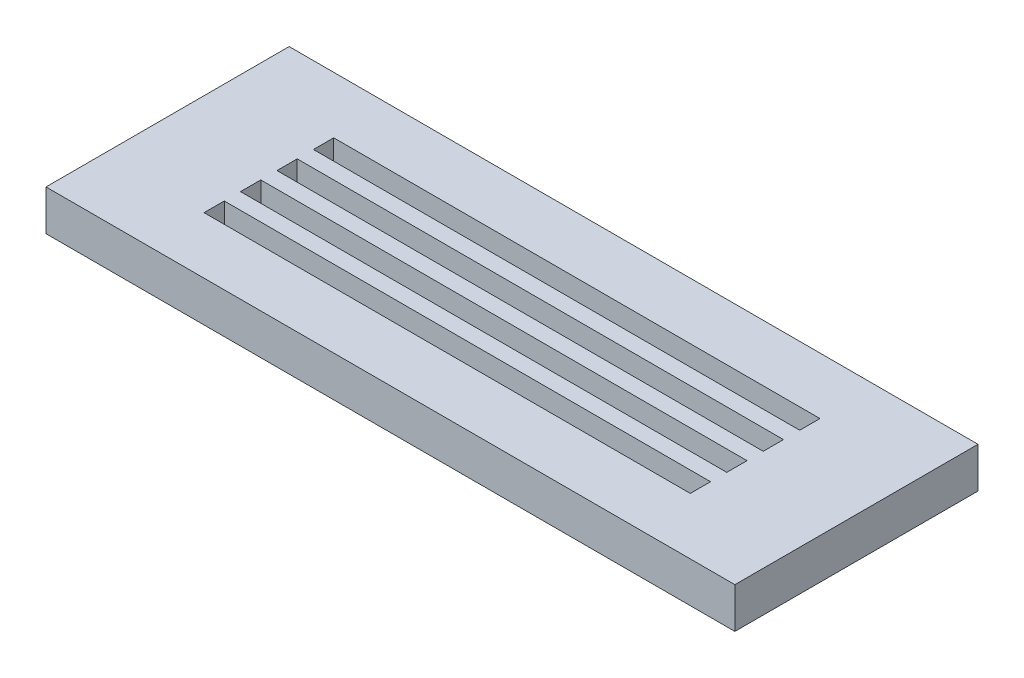
ISO-10303-21;
HEADER;
FILE_DESCRIPTION(('STEP AP214'),'2;1');
FILE_NAME('part.step','',(''),(''),'','','');
FILE_SCHEMA(('AUTOMOTIVE_DESIGN { 1 0 10303 214 1 1 1 1 }'));
ENDSEC;
DATA;
#1=APPLICATION_CONTEXT('core data for automotive mechanical design processes');
#2=APPLICATION_PROTOCOL_DEFINITION('international standard','automotive_design',2000,#1);
#3=PRODUCT_CONTEXT('',#1,'mechanical');
#4=PRODUCT('Part','Part','',(#3));
#5=PRODUCT_RELATED_PRODUCT_CATEGORY('part','',(#4));
#6=PRODUCT_DEFINITION_FORMATION('','',#4);
#7=PRODUCT_DEFINITION_CONTEXT('part definition',#1,'design');
#8=PRODUCT_DEFINITION('design','',#6,#7);
#9=PRODUCT_DEFINITION_SHAPE('','',#8);
#10=(LENGTH_UNIT() NAMED_UNIT(*) SI_UNIT(.MILLI.,.METRE.));
#11=(NAMED_UNIT(*) PLANE_ANGLE_UNIT() SI_UNIT($,.RADIAN.));
#12=(NAMED_UNIT(*) SI_UNIT($,.STERADIAN.) SOLID_ANGLE_UNIT());
#13=UNCERTAINTY_MEASURE_WITH_UNIT(LENGTH_MEASURE(1.E-05),#10,'distance_accuracy_value','');
#14=(GEOMETRIC_REPRESENTATION_CONTEXT(3) GLOBAL_UNCERTAINTY_ASSIGNED_CONTEXT((#13)) GLOBAL_UNIT_ASSIGNED_CONTEXT((#10,
#11,#12)) REPRESENTATION_CONTEXT('',''));
#15=CARTESIAN_POINT('',(0.,0.,0.));
#16=DIRECTION('',(0.,0.,1.));
#17=DIRECTION('',(1.,0.,0.));
#18=AXIS2_PLACEMENT_3D('',#15,#16,#17);
#19=CARTESIAN_POINT('',(0.,5.,0.));
#20=DIRECTION('',(1.,0.,0.));
#21=DIRECTION('',(0.,0.,-1.));
#22=AXIS2_PLACEMENT_3D('',#19,#20,#21);
#23=PLANE('',#22);
#24=DIRECTION('',(0.,0.,1.));
#25=VECTOR('',#24,1.);
#26=CARTESIAN_POINT('',(0.,0.,0.));
#27=LINE('',#26,#25);
#28=CARTESIAN_POINT('',(0.,0.,-30.));
#29=VERTEX_POINT('',#28);
#30=CARTESIAN_POINT('',(0.,0.,0.));
#31=VERTEX_POINT('',#30);
#32=EDGE_CURVE('E223',#29,#31,#27,.T.);
#33=ORIENTED_EDGE('',*,*,#32,.T.);
#34=DIRECTION('',(0.,-1.,0.));
#35=VECTOR('',#34,1.);
#36=CARTESIAN_POINT('',(0.,5.,0.));
#37=LINE('',#36,#35);
#38=CARTESIAN_POINT('',(0.,5.,0.));
#39=VERTEX_POINT('',#38);
#40=EDGE_CURVE('E11',#39,#31,#37,.T.);
#41=ORIENTED_EDGE('',*,*,#40,.F.);
#42=DIRECTION('',(0.,0.,1.));
#43=VECTOR('',#42,1.);
#44=CARTESIAN_POINT('',(0.,5.,0.));
#45=LINE('',#44,#43);
#46=CARTESIAN_POINT('',(0.,5.,-30.));
#47=VERTEX_POINT('',#46);
#48=EDGE_CURVE('E358',#47,#39,#45,.T.);
#49=ORIENTED_EDGE('',*,*,#48,.F.);
#50=DIRECTION('',(0.,-1.,0.));
#51=VECTOR('',#50,1.);
#52=CARTESIAN_POINT('',(0.,5.,-30.));
#53=LINE('',#52,#51);
#54=EDGE_CURVE('E372',#47,#29,#53,.T.);
#55=ORIENTED_EDGE('',*,*,#54,.T.);
#56=EDGE_LOOP('',(#33,#41,#49,#55));
#57=FACE_BOUND('',#56,.T.);
#58=ADVANCED_FACE('F39',(#57),#23,.F.);
#59=CARTESIAN_POINT('',(0.,5.,0.));
#60=DIRECTION('',(0.,0.,-1.));
#61=DIRECTION('',(-1.,0.,0.));
#62=AXIS2_PLACEMENT_3D('',#59,#60,#61);
#63=PLANE('',#62);
#64=DIRECTION('',(1.,0.,0.));
#65=VECTOR('',#64,1.);
#66=CARTESIAN_POINT('',(0.,0.,0.));
#67=LINE('',#66,#65);
#68=CARTESIAN_POINT('',(85.,0.,0.));
#69=VERTEX_POINT('',#68);
#70=EDGE_CURVE('E376',#31,#69,#67,.T.);
#71=ORIENTED_EDGE('',*,*,#70,.T.);
#72=DIRECTION('',(0.,-1.,0.));
#73=VECTOR('',#72,1.);
#74=CARTESIAN_POINT('',(85.,5.,0.));
#75=LINE('',#74,#73);
#76=CARTESIAN_POINT('',(85.,5.,0.));
#77=VERTEX_POINT('',#76);
#78=EDGE_CURVE('E47',#77,#69,#75,.T.);
#79=ORIENTED_EDGE('',*,*,#78,.F.);
#80=DIRECTION('',(1.,0.,0.));
#81=VECTOR('',#80,1.);
#82=CARTESIAN_POINT('',(0.,5.,0.));
#83=LINE('',#82,#81);
#84=EDGE_CURVE('E362',#39,#77,#83,.T.);
#85=ORIENTED_EDGE('',*,*,#84,.F.);
#86=ORIENTED_EDGE('',*,*,#40,.T.);
#87=EDGE_LOOP('',(#71,#79,#85,#86));
#88=FACE_BOUND('',#87,.T.);
#89=ADVANCED_FACE('F411',(#88),#63,.F.);
#90=CARTESIAN_POINT('',(85.,5.,0.));
#91=DIRECTION('',(-1.,0.,0.));
#92=DIRECTION('',(0.,0.,1.));
#93=AXIS2_PLACEMENT_3D('',#90,#91,#92);
#94=PLANE('',#93);
#95=DIRECTION('',(0.,0.,-1.));
#96=VECTOR('',#95,1.);
#97=CARTESIAN_POINT('',(85.,0.,0.));
#98=LINE('',#97,#96);
#99=CARTESIAN_POINT('',(85.,0.,-30.));
#100=VERTEX_POINT('',#99);
#101=EDGE_CURVE('E379',#69,#100,#98,.T.);
#102=ORIENTED_EDGE('',*,*,#101,.T.);
#103=DIRECTION('',(0.,-1.,0.));
#104=VECTOR('',#103,1.);
#105=CARTESIAN_POINT('',(85.,5.,-30.));
#106=LINE('',#105,#104);
#107=CARTESIAN_POINT('',(85.,5.,-30.));
#108=VERTEX_POINT('',#107);
#109=EDGE_CURVE('E387',#108,#100,#106,.T.);
#110=ORIENTED_EDGE('',*,*,#109,.F.);
#111=DIRECTION('',(0.,0.,-1.));
#112=VECTOR('',#111,1.);
#113=CARTESIAN_POINT('',(85.,5.,0.));
#114=LINE('',#113,#112);
#115=EDGE_CURVE('E366',#77,#108,#114,.T.);
#116=ORIENTED_EDGE('',*,*,#115,.F.);
#117=ORIENTED_EDGE('',*,*,#78,.T.);
#118=EDGE_LOOP('',(#102,#110,#116,#117));
#119=FACE_BOUND('',#118,.T.);
#120=ADVANCED_FACE('F396',(#119),#94,.F.);
#121=CARTESIAN_POINT('',(0.,5.,-30.));
#122=DIRECTION('',(0.,0.,1.));
#123=DIRECTION('',(1.,0.,0.));
#124=AXIS2_PLACEMENT_3D('',#121,#122,#123);
#125=PLANE('',#124);
#126=DIRECTION('',(-1.,0.,0.));
#127=VECTOR('',#126,1.);
#128=CARTESIAN_POINT('',(0.,0.,-30.));
#129=LINE('',#128,#127);
#130=EDGE_CURVE('E363',#100,#29,#129,.T.);
#131=ORIENTED_EDGE('',*,*,#130,.T.);
#132=ORIENTED_EDGE('',*,*,#54,.F.);
#133=DIRECTION('',(-1.,0.,0.));
#134=VECTOR('',#133,1.);
#135=CARTESIAN_POINT('',(0.,5.,-30.));
#136=LINE('',#135,#134);
#137=EDGE_CURVE('E369',#108,#47,#136,.T.);
#138=ORIENTED_EDGE('',*,*,#137,.F.);
#139=ORIENTED_EDGE('',*,*,#109,.T.);
#140=EDGE_LOOP('',(#131,#132,#138,#139));
#141=FACE_BOUND('',#140,.T.);
#142=ADVANCED_FACE('F404',(#141),#125,.F.);
#143=CARTESIAN_POINT('',(0.,5.,0.));
#144=DIRECTION('',(0.,-1.,0.));
#145=DIRECTION('',(0.,0.,-1.));
#146=AXIS2_PLACEMENT_3D('',#143,#144,#145);
#147=PLANE('',#146);
#148=DIRECTION('',(1.,0.,0.));
#149=VECTOR('',#148,1.);
#150=CARTESIAN_POINT('',(12.5,5.,-20.5));
#151=LINE('',#150,#149);
#152=CARTESIAN_POINT('',(12.5,5.,-20.5));
#153=VERTEX_POINT('',#152);
#154=CARTESIAN_POINT('',(72.5,5.,-20.5));
#155=VERTEX_POINT('',#154);
#156=EDGE_CURVE('E213',#153,#155,#151,.T.);
#157=ORIENTED_EDGE('',*,*,#156,.F.);
#158=DIRECTION('',(0.,0.,1.));
#159=VECTOR('',#158,1.);
#160=CARTESIAN_POINT('',(12.5,5.,-23.));
#161=LINE('',#160,#159);
#162=CARTESIAN_POINT('',(12.5,5.,-23.));
#163=VERTEX_POINT('',#162);
#164=EDGE_CURVE('E54',#163,#153,#161,.T.);
#165=ORIENTED_EDGE('',*,*,#164,.F.);
#166=DIRECTION('',(-1.,0.,0.));
#167=VECTOR('',#166,1.);
#168=CARTESIAN_POINT('',(12.5,5.,-23.));
#169=LINE('',#168,#167);
#170=CARTESIAN_POINT('',(72.5,5.,-23.));
#171=VERTEX_POINT('',#170);
#172=EDGE_CURVE('E200',#171,#163,#169,.T.);
#173=ORIENTED_EDGE('',*,*,#172,.F.);
#174=DIRECTION('',(0.,0.,-1.));
#175=VECTOR('',#174,1.);
#176=CARTESIAN_POINT('',(72.5,5.,-23.));
#177=LINE('',#176,#175);
#178=EDGE_CURVE('E204',#155,#171,#177,.T.);
#179=ORIENTED_EDGE('',*,*,#178,.F.);
#180=EDGE_LOOP('',(#157,#165,#173,#179));
#181=FACE_BOUND('',#180,.T.);
#182=DIRECTION('',(1.,0.,0.));
#183=VECTOR('',#182,1.);
#184=CARTESIAN_POINT('',(12.5,5.,-16.));
#185=LINE('',#184,#183);
#186=CARTESIAN_POINT('',(12.5,5.,-16.));
#187=VERTEX_POINT('',#186);
#188=CARTESIAN_POINT('',(72.5,5.,-16.));
#189=VERTEX_POINT('',#188);
#190=EDGE_CURVE('E249',#187,#189,#185,.T.);
#191=ORIENTED_EDGE('',*,*,#190,.F.);
#192=DIRECTION('',(0.,0.,1.));
#193=VECTOR('',#192,1.);
#194=CARTESIAN_POINT('',(12.5,5.,-18.5));
#195=LINE('',#194,#193);
#196=CARTESIAN_POINT('',(12.5,5.,-18.5));
#197=VERTEX_POINT('',#196);
#198=EDGE_CURVE('E62',#197,#187,#195,.T.);
#199=ORIENTED_EDGE('',*,*,#198,.F.);
#200=DIRECTION('',(-1.,0.,0.));
#201=VECTOR('',#200,1.);
#202=CARTESIAN_POINT('',(12.5,5.,-18.5));
#203=LINE('',#202,#201);
#204=CARTESIAN_POINT('',(72.5,5.,-18.5));
#205=VERTEX_POINT('',#204);
#206=EDGE_CURVE('E234',#205,#197,#203,.T.);
#207=ORIENTED_EDGE('',*,*,#206,.F.);
#208=DIRECTION('',(0.,0.,-1.));
#209=VECTOR('',#208,1.);
#210=CARTESIAN_POINT('',(72.5,5.,-18.5));
#211=LINE('',#210,#209);
#212=EDGE_CURVE('E254',#189,#205,#211,.T.);
#213=ORIENTED_EDGE('',*,*,#212,.F.);
#214=EDGE_LOOP('',(#191,#199,#207,#213));
#215=FACE_BOUND('',#214,.T.);
#216=DIRECTION('',(1.,0.,0.));
#217=VECTOR('',#216,1.);
#218=CARTESIAN_POINT('',(12.5,5.,-11.5));
#219=LINE('',#218,#217);
#220=CARTESIAN_POINT('',(12.5,5.,-11.5));
#221=VERTEX_POINT('',#220);
#222=CARTESIAN_POINT('',(72.5,5.,-11.5));
#223=VERTEX_POINT('',#222);
#224=EDGE_CURVE('E292',#221,#223,#219,.T.);
#225=ORIENTED_EDGE('',*,*,#224,.F.);
#226=DIRECTION('',(0.,0.,1.));
#227=VECTOR('',#226,1.);
#228=CARTESIAN_POINT('',(12.5,5.,-14.));
#229=LINE('',#228,#227);
#230=CARTESIAN_POINT('',(12.5,5.,-14.));
#231=VERTEX_POINT('',#230);
#232=EDGE_CURVE('E289',#231,#221,#229,.T.);
#233=ORIENTED_EDGE('',*,*,#232,.F.);
#234=DIRECTION('',(-1.,0.,0.));
#235=VECTOR('',#234,1.);
#236=CARTESIAN_POINT('',(12.5,5.,-14.));
#237=LINE('',#236,#235);
#238=CARTESIAN_POINT('',(72.5,5.,-14.));
#239=VERTEX_POINT('',#238);
#240=EDGE_CURVE('E276',#239,#231,#237,.T.);
#241=ORIENTED_EDGE('',*,*,#240,.F.);
#242=DIRECTION('',(0.,0.,-1.));
#243=VECTOR('',#242,1.);
#244=CARTESIAN_POINT('',(72.5,5.,-14.));
#245=LINE('',#244,#243);
#246=EDGE_CURVE('E297',#223,#239,#245,.T.);
#247=ORIENTED_EDGE('',*,*,#246,.F.);
#248=EDGE_LOOP('',(#225,#233,#241,#247));
#249=FACE_BOUND('',#248,.T.);
#250=DIRECTION('',(1.,0.,0.));
#251=VECTOR('',#250,1.);
#252=CARTESIAN_POINT('',(12.5,5.,-7.));
#253=LINE('',#252,#251);
#254=CARTESIAN_POINT('',(12.5,5.,-7.));
#255=VERTEX_POINT('',#254);
#256=CARTESIAN_POINT('',(72.5,5.,-7.));
#257=VERTEX_POINT('',#256);
#258=EDGE_CURVE('E336',#255,#257,#253,.T.);
#259=ORIENTED_EDGE('',*,*,#258,.F.);
#260=DIRECTION('',(0.,0.,1.));
#261=VECTOR('',#260,1.);
#262=CARTESIAN_POINT('',(12.5,5.,-9.5));
#263=LINE('',#262,#261);
#264=CARTESIAN_POINT('',(12.5,5.,-9.5));
#265=VERTEX_POINT('',#264);
#266=EDGE_CURVE('E333',#265,#255,#263,.T.);
#267=ORIENTED_EDGE('',*,*,#266,.F.);
#268=DIRECTION('',(-1.,0.,0.));
#269=VECTOR('',#268,1.);
#270=CARTESIAN_POINT('',(12.5,5.,-9.5));
#271=LINE('',#270,#269);
#272=CARTESIAN_POINT('',(72.5,5.,-9.5));
#273=VERTEX_POINT('',#272);
#274=EDGE_CURVE('E320',#273,#265,#271,.T.);
#275=ORIENTED_EDGE('',*,*,#274,.F.);
#276=DIRECTION('',(0.,0.,-1.));
#277=VECTOR('',#276,1.);
#278=CARTESIAN_POINT('',(72.5,5.,-9.5));
#279=LINE('',#278,#277);
#280=EDGE_CURVE('E340',#257,#273,#279,.T.);
#281=ORIENTED_EDGE('',*,*,#280,.F.);
#282=EDGE_LOOP('',(#259,#267,#275,#281));
#283=FACE_BOUND('',#282,.T.);
#284=ORIENTED_EDGE('',*,*,#48,.T.);
#285=ORIENTED_EDGE('',*,*,#84,.T.);
#286=ORIENTED_EDGE('',*,*,#115,.T.);
#287=ORIENTED_EDGE('',*,*,#137,.T.);
#288=EDGE_LOOP('',(#284,#285,#286,#287));
#289=FACE_BOUND('',#288,.T.);
#290=ADVANCED_FACE('F410',(#181,#215,#249,#283,#289),#147,.F.);
#291=CARTESIAN_POINT('',(0.,0.,0.));
#292=DIRECTION('',(0.,-1.,0.));
#293=DIRECTION('',(0.,0.,-1.));
#294=AXIS2_PLACEMENT_3D('',#291,#292,#293);
#295=PLANE('',#294);
#296=DIRECTION('',(0.,0.,1.));
#297=VECTOR('',#296,1.);
#298=CARTESIAN_POINT('',(12.5,0.,-23.));
#299=LINE('',#298,#297);
#300=CARTESIAN_POINT('',(12.5,0.,-23.));
#301=VERTEX_POINT('',#300);
#302=CARTESIAN_POINT('',(12.5,0.,-20.5));
#303=VERTEX_POINT('',#302);
#304=EDGE_CURVE('E178',#301,#303,#299,.T.);
#305=ORIENTED_EDGE('',*,*,#304,.T.);
#306=DIRECTION('',(1.,0.,0.));
#307=VECTOR('',#306,1.);
#308=CARTESIAN_POINT('',(12.5,0.,-20.5));
#309=LINE('',#308,#307);
#310=CARTESIAN_POINT('',(72.5,0.,-20.5));
#311=VERTEX_POINT('',#310);
#312=EDGE_CURVE('E189',#303,#311,#309,.T.);
#313=ORIENTED_EDGE('',*,*,#312,.T.);
#314=DIRECTION('',(0.,0.,-1.));
#315=VECTOR('',#314,1.);
#316=CARTESIAN_POINT('',(72.5,0.,-23.));
#317=LINE('',#316,#315);
#318=CARTESIAN_POINT('',(72.5,0.,-23.));
#319=VERTEX_POINT('',#318);
#320=EDGE_CURVE('E194',#311,#319,#317,.T.);
#321=ORIENTED_EDGE('',*,*,#320,.T.);
#322=DIRECTION('',(-1.,0.,0.));
#323=VECTOR('',#322,1.);
#324=CARTESIAN_POINT('',(12.5,0.,-23.));
#325=LINE('',#324,#323);
#326=EDGE_CURVE('E185',#319,#301,#325,.T.);
#327=ORIENTED_EDGE('',*,*,#326,.T.);
#328=EDGE_LOOP('',(#305,#313,#321,#327));
#329=FACE_BOUND('',#328,.T.);
#330=DIRECTION('',(0.,0.,1.));
#331=VECTOR('',#330,1.);
#332=CARTESIAN_POINT('',(12.5,0.,-18.5));
#333=LINE('',#332,#331);
#334=CARTESIAN_POINT('',(12.5,0.,-18.5));
#335=VERTEX_POINT('',#334);
#336=CARTESIAN_POINT('',(12.5,0.,-16.));
#337=VERTEX_POINT('',#336);
#338=EDGE_CURVE('E229',#335,#337,#333,.T.);
#339=ORIENTED_EDGE('',*,*,#338,.T.);
#340=DIRECTION('',(1.,0.,0.));
#341=VECTOR('',#340,1.);
#342=CARTESIAN_POINT('',(12.5,0.,-16.));
#343=LINE('',#342,#341);
#344=CARTESIAN_POINT('',(72.5,0.,-16.));
#345=VERTEX_POINT('',#344);
#346=EDGE_CURVE('E233',#337,#345,#343,.T.);
#347=ORIENTED_EDGE('',*,*,#346,.T.);
#348=DIRECTION('',(0.,0.,-1.));
#349=VECTOR('',#348,1.);
#350=CARTESIAN_POINT('',(72.5,0.,-18.5));
#351=LINE('',#350,#349);
#352=CARTESIAN_POINT('',(72.5,0.,-18.5));
#353=VERTEX_POINT('',#352);
#354=EDGE_CURVE('E238',#345,#353,#351,.T.);
#355=ORIENTED_EDGE('',*,*,#354,.T.);
#356=DIRECTION('',(-1.,0.,0.));
#357=VECTOR('',#356,1.);
#358=CARTESIAN_POINT('',(12.5,0.,-18.5));
#359=LINE('',#358,#357);
#360=EDGE_CURVE('E242',#353,#335,#359,.T.);
#361=ORIENTED_EDGE('',*,*,#360,.T.);
#362=EDGE_LOOP('',(#339,#347,#355,#361));
#363=FACE_BOUND('',#362,.T.);
#364=DIRECTION('',(0.,0.,1.));
#365=VECTOR('',#364,1.);
#366=CARTESIAN_POINT('',(12.5,0.,-14.));
#367=LINE('',#366,#365);
#368=CARTESIAN_POINT('',(12.5,0.,-14.));
#369=VERTEX_POINT('',#368);
#370=CARTESIAN_POINT('',(12.5,0.,-11.5));
#371=VERTEX_POINT('',#370);
#372=EDGE_CURVE('E271',#369,#371,#367,.T.);
#373=ORIENTED_EDGE('',*,*,#372,.T.);
#374=DIRECTION('',(1.,0.,0.));
#375=VECTOR('',#374,1.);
#376=CARTESIAN_POINT('',(12.5,0.,-11.5));
#377=LINE('',#376,#375);
#378=CARTESIAN_POINT('',(72.5,0.,-11.5));
#379=VERTEX_POINT('',#378);
#380=EDGE_CURVE('E275',#371,#379,#377,.T.);
#381=ORIENTED_EDGE('',*,*,#380,.T.);
#382=DIRECTION('',(0.,0.,-1.));
#383=VECTOR('',#382,1.);
#384=CARTESIAN_POINT('',(72.5,0.,-14.));
#385=LINE('',#384,#383);
#386=CARTESIAN_POINT('',(72.5,0.,-14.));
#387=VERTEX_POINT('',#386);
#388=EDGE_CURVE('E280',#379,#387,#385,.T.);
#389=ORIENTED_EDGE('',*,*,#388,.T.);
#390=DIRECTION('',(-1.,0.,0.));
#391=VECTOR('',#390,1.);
#392=CARTESIAN_POINT('',(12.5,0.,-14.));
#393=LINE('',#392,#391);
#394=EDGE_CURVE('E284',#387,#369,#393,.T.);
#395=ORIENTED_EDGE('',*,*,#394,.T.);
#396=EDGE_LOOP('',(#373,#381,#389,#395));
#397=FACE_BOUND('',#396,.T.);
#398=DIRECTION('',(0.,0.,1.));
#399=VECTOR('',#398,1.);
#400=CARTESIAN_POINT('',(12.5,0.,-9.5));
#401=LINE('',#400,#399);
#402=CARTESIAN_POINT('',(12.5,0.,-9.5));
#403=VERTEX_POINT('',#402);
#404=CARTESIAN_POINT('',(12.5,0.,-7.));
#405=VERTEX_POINT('',#404);
#406=EDGE_CURVE('E315',#403,#405,#401,.T.);
#407=ORIENTED_EDGE('',*,*,#406,.T.);
#408=DIRECTION('',(1.,0.,0.));
#409=VECTOR('',#408,1.);
#410=CARTESIAN_POINT('',(12.5,0.,-7.));
#411=LINE('',#410,#409);
#412=CARTESIAN_POINT('',(72.5,0.,-7.));
#413=VERTEX_POINT('',#412);
#414=EDGE_CURVE('E319',#405,#413,#411,.T.);
#415=ORIENTED_EDGE('',*,*,#414,.T.);
#416=DIRECTION('',(0.,0.,-1.));
#417=VECTOR('',#416,1.);
#418=CARTESIAN_POINT('',(72.5,0.,-9.5));
#419=LINE('',#418,#417);
#420=CARTESIAN_POINT('',(72.5,0.,-9.5));
#421=VERTEX_POINT('',#420);
#422=EDGE_CURVE('E324',#413,#421,#419,.T.);
#423=ORIENTED_EDGE('',*,*,#422,.T.);
#424=DIRECTION('',(-1.,0.,0.));
#425=VECTOR('',#424,1.);
#426=CARTESIAN_POINT('',(12.5,0.,-9.5));
#427=LINE('',#426,#425);
#428=EDGE_CURVE('E328',#421,#403,#427,.T.);
#429=ORIENTED_EDGE('',*,*,#428,.T.);
#430=EDGE_LOOP('',(#407,#415,#423,#429));
#431=FACE_BOUND('',#430,.T.);
#432=ORIENTED_EDGE('',*,*,#32,.F.);
#433=ORIENTED_EDGE('',*,*,#130,.F.);
#434=ORIENTED_EDGE('',*,*,#101,.F.);
#435=ORIENTED_EDGE('',*,*,#70,.F.);
#436=EDGE_LOOP('',(#432,#433,#434,#435));
#437=FACE_BOUND('',#436,.T.);
#438=ADVANCED_FACE('F196',(#329,#363,#397,#431,#437),#295,.T.);
#439=CARTESIAN_POINT('',(12.5,0.,-9.5));
#440=DIRECTION('',(-1.,0.,0.));
#441=DIRECTION('',(0.,0.,1.));
#442=AXIS2_PLACEMENT_3D('',#439,#440,#441);
#443=PLANE('',#442);
#444=ORIENTED_EDGE('',*,*,#266,.T.);
#445=DIRECTION('',(0.,1.,0.));
#446=VECTOR('',#445,1.);
#447=CARTESIAN_POINT('',(12.5,0.,-7.));
#448=LINE('',#447,#446);
#449=EDGE_CURVE('E332',#405,#255,#448,.T.);
#450=ORIENTED_EDGE('',*,*,#449,.F.);
#451=ORIENTED_EDGE('',*,*,#406,.F.);
#452=DIRECTION('',(0.,1.,0.));
#453=VECTOR('',#452,1.);
#454=CARTESIAN_POINT('',(12.5,0.,-9.5));
#455=LINE('',#454,#453);
#456=EDGE_CURVE('E293',#403,#265,#455,.T.);
#457=ORIENTED_EDGE('',*,*,#456,.T.);
#458=EDGE_LOOP('',(#444,#450,#451,#457));
#459=FACE_BOUND('',#458,.T.);
#460=ADVANCED_FACE('F423',(#459),#443,.F.);
#461=CARTESIAN_POINT('',(12.5,0.,-9.5));
#462=DIRECTION('',(0.,0.,-1.));
#463=DIRECTION('',(-1.,0.,0.));
#464=AXIS2_PLACEMENT_3D('',#461,#462,#463);
#465=PLANE('',#464);
#466=ORIENTED_EDGE('',*,*,#274,.T.);
#467=ORIENTED_EDGE('',*,*,#456,.F.);
#468=ORIENTED_EDGE('',*,*,#428,.F.);
#469=DIRECTION('',(0.,1.,0.));
#470=VECTOR('',#469,1.);
#471=CARTESIAN_POINT('',(72.5,0.,-9.5));
#472=LINE('',#471,#470);
#473=EDGE_CURVE('E349',#421,#273,#472,.T.);
#474=ORIENTED_EDGE('',*,*,#473,.T.);
#475=EDGE_LOOP('',(#466,#467,#468,#474));
#476=FACE_BOUND('',#475,.T.);
#477=ADVANCED_FACE('F429',(#476),#465,.F.);
#478=CARTESIAN_POINT('',(72.5,0.,-9.5));
#479=DIRECTION('',(1.,0.,0.));
#480=DIRECTION('',(0.,0.,-1.));
#481=AXIS2_PLACEMENT_3D('',#478,#479,#480);
#482=PLANE('',#481);
#483=ORIENTED_EDGE('',*,*,#280,.T.);
#484=ORIENTED_EDGE('',*,*,#473,.F.);
#485=ORIENTED_EDGE('',*,*,#422,.F.);
#486=DIRECTION('',(0.,1.,0.));
#487=VECTOR('',#486,1.);
#488=CARTESIAN_POINT('',(72.5,0.,-7.));
#489=LINE('',#488,#487);
#490=EDGE_CURVE('E352',#413,#257,#489,.T.);
#491=ORIENTED_EDGE('',*,*,#490,.T.);
#492=EDGE_LOOP('',(#483,#484,#485,#491));
#493=FACE_BOUND('',#492,.T.);
#494=ADVANCED_FACE('F435',(#493),#482,.F.);
#495=CARTESIAN_POINT('',(12.5,0.,-7.));
#496=DIRECTION('',(0.,0.,1.));
#497=DIRECTION('',(1.,0.,0.));
#498=AXIS2_PLACEMENT_3D('',#495,#496,#497);
#499=PLANE('',#498);
#500=ORIENTED_EDGE('',*,*,#258,.T.);
#501=ORIENTED_EDGE('',*,*,#490,.F.);
#502=ORIENTED_EDGE('',*,*,#414,.F.);
#503=ORIENTED_EDGE('',*,*,#449,.T.);
#504=EDGE_LOOP('',(#500,#501,#502,#503));
#505=FACE_BOUND('',#504,.T.);
#506=ADVANCED_FACE('F431',(#505),#499,.F.);
#507=CARTESIAN_POINT('',(12.5,0.,-14.));
#508=DIRECTION('',(-1.,0.,0.));
#509=DIRECTION('',(0.,0.,1.));
#510=AXIS2_PLACEMENT_3D('',#507,#508,#509);
#511=PLANE('',#510);
#512=ORIENTED_EDGE('',*,*,#232,.T.);
#513=DIRECTION('',(0.,1.,0.));
#514=VECTOR('',#513,1.);
#515=CARTESIAN_POINT('',(12.5,0.,-11.5));
#516=LINE('',#515,#514);
#517=EDGE_CURVE('E288',#371,#221,#516,.T.);
#518=ORIENTED_EDGE('',*,*,#517,.F.);
#519=ORIENTED_EDGE('',*,*,#372,.F.);
#520=DIRECTION('',(0.,1.,0.));
#521=VECTOR('',#520,1.);
#522=CARTESIAN_POINT('',(12.5,0.,-14.));
#523=LINE('',#522,#521);
#524=EDGE_CURVE('E250',#369,#231,#523,.T.);
#525=ORIENTED_EDGE('',*,*,#524,.T.);
#526=EDGE_LOOP('',(#512,#518,#519,#525));
#527=FACE_BOUND('',#526,.T.);
#528=ADVANCED_FACE('F434',(#527),#511,.F.);
#529=CARTESIAN_POINT('',(12.5,0.,-14.));
#530=DIRECTION('',(0.,0.,-1.));
#531=DIRECTION('',(-1.,0.,0.));
#532=AXIS2_PLACEMENT_3D('',#529,#530,#531);
#533=PLANE('',#532);
#534=ORIENTED_EDGE('',*,*,#240,.T.);
#535=ORIENTED_EDGE('',*,*,#524,.F.);
#536=ORIENTED_EDGE('',*,*,#394,.F.);
#537=DIRECTION('',(0.,1.,0.));
#538=VECTOR('',#537,1.);
#539=CARTESIAN_POINT('',(72.5,0.,-14.));
#540=LINE('',#539,#538);
#541=EDGE_CURVE('E306',#387,#239,#540,.T.);
#542=ORIENTED_EDGE('',*,*,#541,.T.);
#543=EDGE_LOOP('',(#534,#535,#536,#542));
#544=FACE_BOUND('',#543,.T.);
#545=ADVANCED_FACE('F445',(#544),#533,.F.);
#546=CARTESIAN_POINT('',(72.5,0.,-14.));
#547=DIRECTION('',(1.,0.,0.));
#548=DIRECTION('',(0.,0.,-1.));
#549=AXIS2_PLACEMENT_3D('',#546,#547,#548);
#550=PLANE('',#549);
#551=ORIENTED_EDGE('',*,*,#246,.T.);
#552=ORIENTED_EDGE('',*,*,#541,.F.);
#553=ORIENTED_EDGE('',*,*,#388,.F.);
#554=DIRECTION('',(0.,1.,0.));
#555=VECTOR('',#554,1.);
#556=CARTESIAN_POINT('',(72.5,0.,-11.5));
#557=LINE('',#556,#555);
#558=EDGE_CURVE('E309',#379,#223,#557,.T.);
#559=ORIENTED_EDGE('',*,*,#558,.T.);
#560=EDGE_LOOP('',(#551,#552,#553,#559));
#561=FACE_BOUND('',#560,.T.);
#562=ADVANCED_FACE('F451',(#561),#550,.F.);
#563=CARTESIAN_POINT('',(12.5,0.,-11.5));
#564=DIRECTION('',(0.,0.,1.));
#565=DIRECTION('',(1.,0.,0.));
#566=AXIS2_PLACEMENT_3D('',#563,#564,#565);
#567=PLANE('',#566);
#568=ORIENTED_EDGE('',*,*,#224,.T.);
#569=ORIENTED_EDGE('',*,*,#558,.F.);
#570=ORIENTED_EDGE('',*,*,#380,.F.);
#571=ORIENTED_EDGE('',*,*,#517,.T.);
#572=EDGE_LOOP('',(#568,#569,#570,#571));
#573=FACE_BOUND('',#572,.T.);
#574=ADVANCED_FACE('F447',(#573),#567,.F.);
#575=CARTESIAN_POINT('',(12.5,0.,-18.5));
#576=DIRECTION('',(-1.,0.,0.));
#577=DIRECTION('',(0.,0.,1.));
#578=AXIS2_PLACEMENT_3D('',#575,#576,#577);
#579=PLANE('',#578);
#580=ORIENTED_EDGE('',*,*,#198,.T.);
#581=DIRECTION('',(0.,1.,0.));
#582=VECTOR('',#581,1.);
#583=CARTESIAN_POINT('',(12.5,0.,-16.));
#584=LINE('',#583,#582);
#585=EDGE_CURVE('E246',#337,#187,#584,.T.);
#586=ORIENTED_EDGE('',*,*,#585,.F.);
#587=ORIENTED_EDGE('',*,*,#338,.F.);
#588=DIRECTION('',(0.,1.,0.));
#589=VECTOR('',#588,1.);
#590=CARTESIAN_POINT('',(12.5,0.,-18.5));
#591=LINE('',#590,#589);
#592=EDGE_CURVE('E214',#335,#197,#591,.T.);
#593=ORIENTED_EDGE('',*,*,#592,.T.);
#594=EDGE_LOOP('',(#580,#586,#587,#593));
#595=FACE_BOUND('',#594,.T.);
#596=ADVANCED_FACE('F450',(#595),#579,.F.);
#597=CARTESIAN_POINT('',(12.5,0.,-18.5));
#598=DIRECTION('',(0.,0.,-1.));
#599=DIRECTION('',(-1.,0.,0.));
#600=AXIS2_PLACEMENT_3D('',#597,#598,#599);
#601=PLANE('',#600);
#602=ORIENTED_EDGE('',*,*,#206,.T.);
#603=ORIENTED_EDGE('',*,*,#592,.F.);
#604=ORIENTED_EDGE('',*,*,#360,.F.);
#605=DIRECTION('',(0.,1.,0.));
#606=VECTOR('',#605,1.);
#607=CARTESIAN_POINT('',(72.5,0.,-18.5));
#608=LINE('',#607,#606);
#609=EDGE_CURVE('E263',#353,#205,#608,.T.);
#610=ORIENTED_EDGE('',*,*,#609,.T.);
#611=EDGE_LOOP('',(#602,#603,#604,#610));
#612=FACE_BOUND('',#611,.T.);
#613=ADVANCED_FACE('F461',(#612),#601,.F.);
#614=CARTESIAN_POINT('',(72.5,0.,-18.5));
#615=DIRECTION('',(1.,0.,0.));
#616=DIRECTION('',(0.,0.,-1.));
#617=AXIS2_PLACEMENT_3D('',#614,#615,#616);
#618=PLANE('',#617);
#619=ORIENTED_EDGE('',*,*,#212,.T.);
#620=ORIENTED_EDGE('',*,*,#609,.F.);
#621=ORIENTED_EDGE('',*,*,#354,.F.);
#622=DIRECTION('',(0.,1.,0.));
#623=VECTOR('',#622,1.);
#624=CARTESIAN_POINT('',(72.5,0.,-16.));
#625=LINE('',#624,#623);
#626=EDGE_CURVE('E266',#345,#189,#625,.T.);
#627=ORIENTED_EDGE('',*,*,#626,.T.);
#628=EDGE_LOOP('',(#619,#620,#621,#627));
#629=FACE_BOUND('',#628,.T.);
#630=ADVANCED_FACE('F465',(#629),#618,.F.);
#631=CARTESIAN_POINT('',(12.5,0.,-16.));
#632=DIRECTION('',(0.,0.,1.));
#633=DIRECTION('',(1.,0.,0.));
#634=AXIS2_PLACEMENT_3D('',#631,#632,#633);
#635=PLANE('',#634);
#636=ORIENTED_EDGE('',*,*,#190,.T.);
#637=ORIENTED_EDGE('',*,*,#626,.F.);
#638=ORIENTED_EDGE('',*,*,#346,.F.);
#639=ORIENTED_EDGE('',*,*,#585,.T.);
#640=EDGE_LOOP('',(#636,#637,#638,#639));
#641=FACE_BOUND('',#640,.T.);
#642=ADVANCED_FACE('F462',(#641),#635,.F.);
#643=CARTESIAN_POINT('',(12.5,0.,-23.));
#644=DIRECTION('',(-1.,0.,0.));
#645=DIRECTION('',(0.,0.,1.));
#646=AXIS2_PLACEMENT_3D('',#643,#644,#645);
#647=PLANE('',#646);
#648=ORIENTED_EDGE('',*,*,#164,.T.);
#649=DIRECTION('',(0.,1.,0.));
#650=VECTOR('',#649,1.);
#651=CARTESIAN_POINT('',(12.5,0.,-20.5));
#652=LINE('',#651,#650);
#653=EDGE_CURVE('E174',#303,#153,#652,.T.);
#654=ORIENTED_EDGE('',*,*,#653,.F.);
#655=ORIENTED_EDGE('',*,*,#304,.F.);
#656=DIRECTION('',(0.,1.,0.));
#657=VECTOR('',#656,1.);
#658=CARTESIAN_POINT('',(12.5,0.,-23.));
#659=LINE('',#658,#657);
#660=EDGE_CURVE('E220',#301,#163,#659,.T.);
#661=ORIENTED_EDGE('',*,*,#660,.T.);
#662=EDGE_LOOP('',(#648,#654,#655,#661));
#663=FACE_BOUND('',#662,.T.);
#664=ADVANCED_FACE('F176',(#663),#647,.F.);
#665=CARTESIAN_POINT('',(12.5,0.,-23.));
#666=DIRECTION('',(0.,0.,-1.));
#667=DIRECTION('',(-1.,0.,0.));
#668=AXIS2_PLACEMENT_3D('',#665,#666,#667);
#669=PLANE('',#668);
#670=ORIENTED_EDGE('',*,*,#172,.T.);
#671=ORIENTED_EDGE('',*,*,#660,.F.);
#672=ORIENTED_EDGE('',*,*,#326,.F.);
#673=DIRECTION('',(0.,1.,0.));
#674=VECTOR('',#673,1.);
#675=CARTESIAN_POINT('',(72.5,0.,-23.));
#676=LINE('',#675,#674);
#677=EDGE_CURVE('E224',#319,#171,#676,.T.);
#678=ORIENTED_EDGE('',*,*,#677,.T.);
#679=EDGE_LOOP('',(#670,#671,#672,#678));
#680=FACE_BOUND('',#679,.T.);
#681=ADVANCED_FACE('F475',(#680),#669,.F.);
#682=CARTESIAN_POINT('',(72.5,0.,-23.));
#683=DIRECTION('',(1.,0.,0.));
#684=DIRECTION('',(0.,0.,-1.));
#685=AXIS2_PLACEMENT_3D('',#682,#683,#684);
#686=PLANE('',#685);
#687=ORIENTED_EDGE('',*,*,#178,.T.);
#688=ORIENTED_EDGE('',*,*,#677,.F.);
#689=ORIENTED_EDGE('',*,*,#320,.F.);
#690=DIRECTION('',(0.,1.,0.));
#691=VECTOR('',#690,1.);
#692=CARTESIAN_POINT('',(72.5,0.,-20.5));
#693=LINE('',#692,#691);
#694=EDGE_CURVE('E184',#311,#155,#693,.T.);
#695=ORIENTED_EDGE('',*,*,#694,.T.);
#696=EDGE_LOOP('',(#687,#688,#689,#695));
#697=FACE_BOUND('',#696,.T.);
#698=ADVANCED_FACE('F478',(#697),#686,.F.);
#699=CARTESIAN_POINT('',(12.5,0.,-20.5));
#700=DIRECTION('',(0.,0.,1.));
#701=DIRECTION('',(1.,0.,0.));
#702=AXIS2_PLACEMENT_3D('',#699,#700,#701);
#703=PLANE('',#702);
#704=ORIENTED_EDGE('',*,*,#156,.T.);
#705=ORIENTED_EDGE('',*,*,#694,.F.);
#706=ORIENTED_EDGE('',*,*,#312,.F.);
#707=ORIENTED_EDGE('',*,*,#653,.T.);
#708=EDGE_LOOP('',(#704,#705,#706,#707));
#709=FACE_BOUND('',#708,.T.);
#710=ADVANCED_FACE('F190',(#709),#703,.F.);
#711=CLOSED_SHELL('',(#58,#89,#120,#142,#290,#438,#460,#477,#494,#506,#528,#545,#562,#574,#596,
#613,#630,#642,#664,#681,#698,#710));
#712=MANIFOLD_SOLID_BREP('B2',#711);
#713=ADVANCED_BREP_SHAPE_REPRESENTATION('',(#18,#712),#14);
#714=SHAPE_DEFINITION_REPRESENTATION(#9,#713);
ENDSEC;
END-ISO-10303-21;
